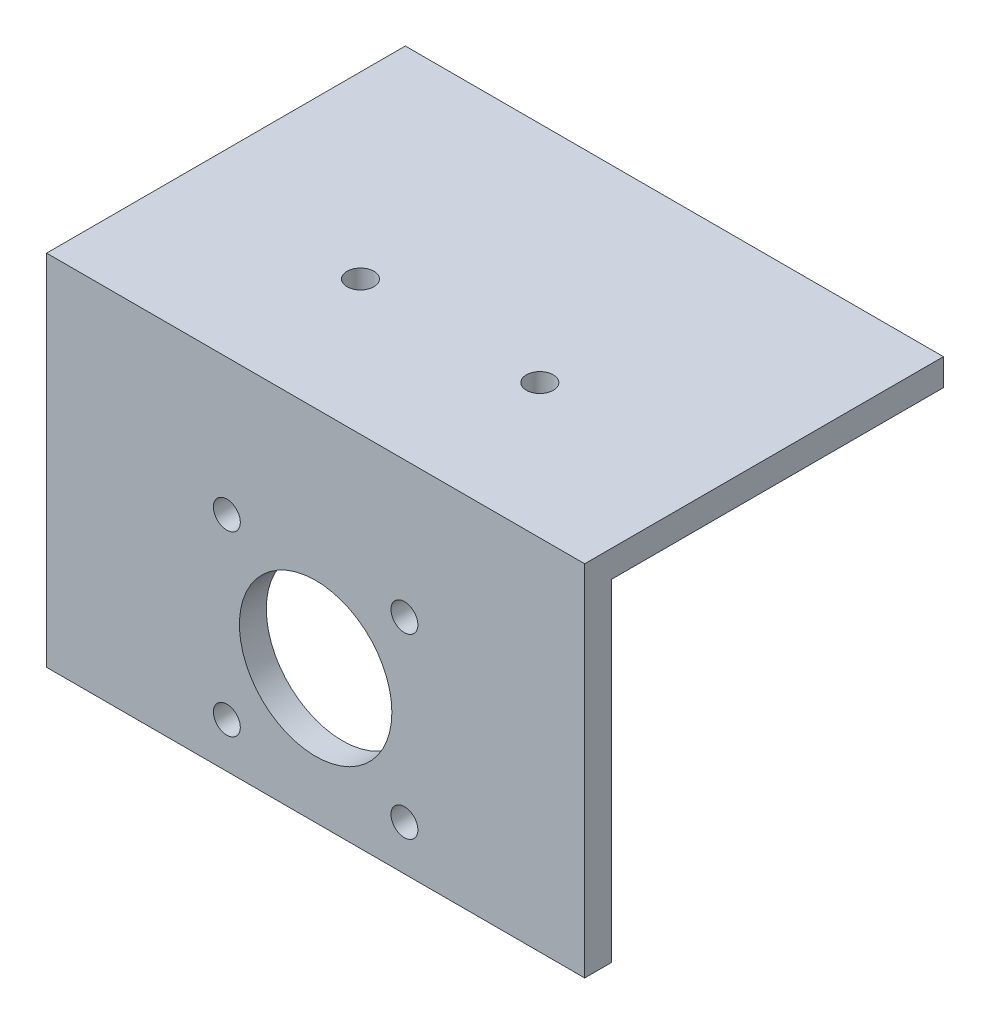
ISO-10303-21;
HEADER;
FILE_DESCRIPTION(('STEP AP214'),'2;1');
FILE_NAME('part.step','',(''),(''),'','','');
FILE_SCHEMA(('AUTOMOTIVE_DESIGN { 1 0 10303 214 1 1 1 1 }'));
ENDSEC;
DATA;
#1=APPLICATION_CONTEXT('core data for automotive mechanical design processes');
#2=APPLICATION_PROTOCOL_DEFINITION('international standard','automotive_design',2000,#1);
#3=PRODUCT_CONTEXT('',#1,'mechanical');
#4=PRODUCT('Part','Part','',(#3));
#5=PRODUCT_RELATED_PRODUCT_CATEGORY('part','',(#4));
#6=PRODUCT_DEFINITION_FORMATION('','',#4);
#7=PRODUCT_DEFINITION_CONTEXT('part definition',#1,'design');
#8=PRODUCT_DEFINITION('design','',#6,#7);
#9=PRODUCT_DEFINITION_SHAPE('','',#8);
#10=(LENGTH_UNIT() NAMED_UNIT(*) SI_UNIT(.MILLI.,.METRE.));
#11=(NAMED_UNIT(*) PLANE_ANGLE_UNIT() SI_UNIT($,.RADIAN.));
#12=(NAMED_UNIT(*) SI_UNIT($,.STERADIAN.) SOLID_ANGLE_UNIT());
#13=UNCERTAINTY_MEASURE_WITH_UNIT(LENGTH_MEASURE(1.E-05),#10,'distance_accuracy_value','');
#14=(GEOMETRIC_REPRESENTATION_CONTEXT(3) GLOBAL_UNCERTAINTY_ASSIGNED_CONTEXT((#13)) GLOBAL_UNIT_ASSIGNED_CONTEXT((#10,
#11,#12)) REPRESENTATION_CONTEXT('',''));
#15=CARTESIAN_POINT('',(0.,0.,0.));
#16=DIRECTION('',(0.,0.,1.));
#17=DIRECTION('',(1.,0.,0.));
#18=AXIS2_PLACEMENT_3D('',#15,#16,#17);
#19=CARTESIAN_POINT('',(-30.,0.,0.));
#20=DIRECTION('',(0.,0.,1.));
#21=DIRECTION('',(0.,-1.,0.));
#22=AXIS2_PLACEMENT_3D('',#19,#20,#21);
#23=PLANE('',#22);
#24=CARTESIAN_POINT('',(9.8995,-15.201,0.));
#25=DIRECTION('',(0.,0.,1.));
#26=DIRECTION('',(1.,0.,0.));
#27=AXIS2_PLACEMENT_3D('',#24,#25,#26);
#28=CIRCLE('',#27,1.5);
#29=CARTESIAN_POINT('',(11.3995,-15.201,0.));
#30=VERTEX_POINT('',#29);
#31=EDGE_CURVE('E177',#30,#30,#28,.T.);
#32=ORIENTED_EDGE('',*,*,#31,.F.);
#33=EDGE_LOOP('',(#32));
#34=FACE_BOUND('',#33,.T.);
#35=CARTESIAN_POINT('',(-9.8995,-35.,0.));
#36=DIRECTION('',(0.,0.,1.));
#37=DIRECTION('',(1.,0.,0.));
#38=AXIS2_PLACEMENT_3D('',#35,#36,#37);
#39=CIRCLE('',#38,1.5);
#40=CARTESIAN_POINT('',(-8.3995,-35.,0.));
#41=VERTEX_POINT('',#40);
#42=EDGE_CURVE('E176',#41,#41,#39,.T.);
#43=ORIENTED_EDGE('',*,*,#42,.F.);
#44=EDGE_LOOP('',(#43));
#45=FACE_BOUND('',#44,.T.);
#46=CARTESIAN_POINT('',(0.,-25.101,0.));
#47=DIRECTION('',(0.,0.,1.));
#48=DIRECTION('',(1.,0.,0.));
#49=AXIS2_PLACEMENT_3D('',#46,#47,#48);
#50=CIRCLE('',#49,8.5);
#51=CARTESIAN_POINT('',(8.5,-25.101,0.));
#52=VERTEX_POINT('',#51);
#53=EDGE_CURVE('E162',#52,#52,#50,.T.);
#54=ORIENTED_EDGE('',*,*,#53,.F.);
#55=EDGE_LOOP('',(#54));
#56=FACE_BOUND('',#55,.T.);
#57=CARTESIAN_POINT('',(9.8995,-35.,0.));
#58=DIRECTION('',(0.,0.,1.));
#59=DIRECTION('',(1.,0.,0.));
#60=AXIS2_PLACEMENT_3D('',#57,#58,#59);
#61=CIRCLE('',#60,1.5);
#62=CARTESIAN_POINT('',(11.3995,-35.,0.));
#63=VERTEX_POINT('',#62);
#64=EDGE_CURVE('E173',#63,#63,#61,.T.);
#65=ORIENTED_EDGE('',*,*,#64,.F.);
#66=EDGE_LOOP('',(#65));
#67=FACE_BOUND('',#66,.T.);
#68=CARTESIAN_POINT('',(-9.8995,-15.201,0.));
#69=DIRECTION('',(0.,0.,1.));
#70=DIRECTION('',(1.,0.,0.));
#71=AXIS2_PLACEMENT_3D('',#68,#69,#70);
#72=CIRCLE('',#71,1.5);
#73=CARTESIAN_POINT('',(-8.3995,-15.201,0.));
#74=VERTEX_POINT('',#73);
#75=EDGE_CURVE('E118',#74,#74,#72,.T.);
#76=ORIENTED_EDGE('',*,*,#75,.F.);
#77=EDGE_LOOP('',(#76));
#78=FACE_BOUND('',#77,.T.);
#79=DIRECTION('',(1.,0.,0.));
#80=VECTOR('',#79,1.);
#81=CARTESIAN_POINT('',(-30.,-40.,0.));
#82=LINE('',#81,#80);
#83=CARTESIAN_POINT('',(-30.,-40.,0.));
#84=VERTEX_POINT('',#83);
#85=CARTESIAN_POINT('',(30.,-40.,0.));
#86=VERTEX_POINT('',#85);
#87=EDGE_CURVE('E89',#84,#86,#82,.T.);
#88=ORIENTED_EDGE('',*,*,#87,.T.);
#89=DIRECTION('',(0.,-1.,0.));
#90=VECTOR('',#89,1.);
#91=CARTESIAN_POINT('',(30.,0.,0.));
#92=LINE('',#91,#90);
#93=CARTESIAN_POINT('',(30.,0.,0.));
#94=VERTEX_POINT('',#93);
#95=EDGE_CURVE('E92',#94,#86,#92,.T.);
#96=ORIENTED_EDGE('',*,*,#95,.F.);
#97=DIRECTION('',(1.,0.,0.));
#98=VECTOR('',#97,1.);
#99=CARTESIAN_POINT('',(-30.,0.,0.));
#100=LINE('',#99,#98);
#101=CARTESIAN_POINT('',(-30.,0.,0.));
#102=VERTEX_POINT('',#101);
#103=EDGE_CURVE('E11',#102,#94,#100,.T.);
#104=ORIENTED_EDGE('',*,*,#103,.F.);
#105=DIRECTION('',(0.,-1.,0.));
#106=VECTOR('',#105,1.);
#107=CARTESIAN_POINT('',(-30.,0.,0.));
#108=LINE('',#107,#106);
#109=EDGE_CURVE('E93',#102,#84,#108,.T.);
#110=ORIENTED_EDGE('',*,*,#109,.T.);
#111=EDGE_LOOP('',(#88,#96,#104,#110));
#112=FACE_BOUND('',#111,.T.);
#113=ADVANCED_FACE('F39',(#34,#45,#56,#67,#78,#112),#23,.T.);
#114=CARTESIAN_POINT('',(-30.,0.,0.));
#115=DIRECTION('',(0.,1.,0.));
#116=DIRECTION('',(0.,0.,1.));
#117=AXIS2_PLACEMENT_3D('',#114,#115,#116);
#118=PLANE('',#117);
#119=CARTESIAN_POINT('',(-10.,0.,-15.));
#120=DIRECTION('',(0.,1.,0.));
#121=DIRECTION('',(0.,0.,1.));
#122=AXIS2_PLACEMENT_3D('',#119,#120,#121);
#123=CIRCLE('',#122,1.5);
#124=CARTESIAN_POINT('',(-10.,0.,-13.5));
#125=VERTEX_POINT('',#124);
#126=EDGE_CURVE('E158',#125,#125,#123,.T.);
#127=ORIENTED_EDGE('',*,*,#126,.F.);
#128=EDGE_LOOP('',(#127));
#129=FACE_BOUND('',#128,.T.);
#130=CARTESIAN_POINT('',(10.,0.,-15.));
#131=DIRECTION('',(0.,1.,0.));
#132=DIRECTION('',(0.,0.,1.));
#133=AXIS2_PLACEMENT_3D('',#130,#131,#132);
#134=CIRCLE('',#133,1.5);
#135=CARTESIAN_POINT('',(10.,0.,-13.5));
#136=VERTEX_POINT('',#135);
#137=EDGE_CURVE('E164',#136,#136,#134,.T.);
#138=ORIENTED_EDGE('',*,*,#137,.F.);
#139=EDGE_LOOP('',(#138));
#140=FACE_BOUND('',#139,.T.);
#141=ORIENTED_EDGE('',*,*,#103,.T.);
#142=DIRECTION('',(0.,0.,1.));
#143=VECTOR('',#142,1.);
#144=CARTESIAN_POINT('',(30.,0.,0.));
#145=LINE('',#144,#143);
#146=CARTESIAN_POINT('',(30.,0.,-40.));
#147=VERTEX_POINT('',#146);
#148=EDGE_CURVE('E111',#147,#94,#145,.T.);
#149=ORIENTED_EDGE('',*,*,#148,.F.);
#150=DIRECTION('',(1.,0.,0.));
#151=VECTOR('',#150,1.);
#152=CARTESIAN_POINT('',(-30.,0.,-40.));
#153=LINE('',#152,#151);
#154=CARTESIAN_POINT('',(-30.,0.,-40.));
#155=VERTEX_POINT('',#154);
#156=EDGE_CURVE('E47',#155,#147,#153,.T.);
#157=ORIENTED_EDGE('',*,*,#156,.F.);
#158=DIRECTION('',(0.,0.,1.));
#159=VECTOR('',#158,1.);
#160=CARTESIAN_POINT('',(-30.,0.,0.));
#161=LINE('',#160,#159);
#162=EDGE_CURVE('E98',#155,#102,#161,.T.);
#163=ORIENTED_EDGE('',*,*,#162,.T.);
#164=EDGE_LOOP('',(#141,#149,#157,#163));
#165=FACE_BOUND('',#164,.T.);
#166=ADVANCED_FACE('F186',(#129,#140,#165),#118,.T.);
#167=CARTESIAN_POINT('',(-30.,0.,-40.));
#168=DIRECTION('',(0.,0.,-1.));
#169=DIRECTION('',(-1.,0.,0.));
#170=AXIS2_PLACEMENT_3D('',#167,#168,#169);
#171=PLANE('',#170);
#172=ORIENTED_EDGE('',*,*,#156,.T.);
#173=DIRECTION('',(0.,1.,0.));
#174=VECTOR('',#173,1.);
#175=CARTESIAN_POINT('',(30.,0.,-40.));
#176=LINE('',#175,#174);
#177=CARTESIAN_POINT('',(30.,-3.,-40.));
#178=VERTEX_POINT('',#177);
#179=EDGE_CURVE('E125',#178,#147,#176,.T.);
#180=ORIENTED_EDGE('',*,*,#179,.F.);
#181=DIRECTION('',(1.,0.,0.));
#182=VECTOR('',#181,1.);
#183=CARTESIAN_POINT('',(-30.,-3.,-40.));
#184=LINE('',#183,#182);
#185=CARTESIAN_POINT('',(-30.,-3.,-40.));
#186=VERTEX_POINT('',#185);
#187=EDGE_CURVE('E141',#186,#178,#184,.T.);
#188=ORIENTED_EDGE('',*,*,#187,.F.);
#189=DIRECTION('',(0.,1.,0.));
#190=VECTOR('',#189,1.);
#191=CARTESIAN_POINT('',(-30.,0.,-40.));
#192=LINE('',#191,#190);
#193=EDGE_CURVE('E137',#186,#155,#192,.T.);
#194=ORIENTED_EDGE('',*,*,#193,.T.);
#195=EDGE_LOOP('',(#172,#180,#188,#194));
#196=FACE_BOUND('',#195,.T.);
#197=ADVANCED_FACE('F218',(#196),#171,.T.);
#198=CARTESIAN_POINT('',(-30.,-3.,-3.));
#199=DIRECTION('',(0.,-1.,0.));
#200=DIRECTION('',(0.,0.,-1.));
#201=AXIS2_PLACEMENT_3D('',#198,#199,#200);
#202=PLANE('',#201);
#203=CARTESIAN_POINT('',(-10.,-3.,-15.));
#204=DIRECTION('',(0.,-1.,0.));
#205=DIRECTION('',(0.,0.,-1.));
#206=AXIS2_PLACEMENT_3D('',#203,#204,#205);
#207=CIRCLE('',#206,1.5);
#208=CARTESIAN_POINT('',(-10.,-3.,-16.5));
#209=VERTEX_POINT('',#208);
#210=EDGE_CURVE('E42',#209,#209,#207,.T.);
#211=ORIENTED_EDGE('',*,*,#210,.F.);
#212=EDGE_LOOP('',(#211));
#213=FACE_BOUND('',#212,.T.);
#214=CARTESIAN_POINT('',(10.,-3.,-15.));
#215=DIRECTION('',(0.,-1.,0.));
#216=DIRECTION('',(0.,0.,-1.));
#217=AXIS2_PLACEMENT_3D('',#214,#215,#216);
#218=CIRCLE('',#217,1.5);
#219=CARTESIAN_POINT('',(10.,-3.,-16.5));
#220=VERTEX_POINT('',#219);
#221=EDGE_CURVE('E156',#220,#220,#218,.T.);
#222=ORIENTED_EDGE('',*,*,#221,.F.);
#223=EDGE_LOOP('',(#222));
#224=FACE_BOUND('',#223,.T.);
#225=ORIENTED_EDGE('',*,*,#187,.T.);
#226=DIRECTION('',(0.,0.,-1.));
#227=VECTOR('',#226,1.);
#228=CARTESIAN_POINT('',(30.,-3.,-3.));
#229=LINE('',#228,#227);
#230=CARTESIAN_POINT('',(30.,-3.,-3.));
#231=VERTEX_POINT('',#230);
#232=EDGE_CURVE('E122',#231,#178,#229,.T.);
#233=ORIENTED_EDGE('',*,*,#232,.F.);
#234=DIRECTION('',(1.,0.,0.));
#235=VECTOR('',#234,1.);
#236=CARTESIAN_POINT('',(-30.,-3.,-3.));
#237=LINE('',#236,#235);
#238=CARTESIAN_POINT('',(-30.,-3.,-3.));
#239=VERTEX_POINT('',#238);
#240=EDGE_CURVE('E143',#239,#231,#237,.T.);
#241=ORIENTED_EDGE('',*,*,#240,.F.);
#242=DIRECTION('',(0.,0.,-1.));
#243=VECTOR('',#242,1.);
#244=CARTESIAN_POINT('',(-30.,-3.,-3.));
#245=LINE('',#244,#243);
#246=EDGE_CURVE('E134',#239,#186,#245,.T.);
#247=ORIENTED_EDGE('',*,*,#246,.T.);
#248=EDGE_LOOP('',(#225,#233,#241,#247));
#249=FACE_BOUND('',#248,.T.);
#250=ADVANCED_FACE('F222',(#213,#224,#249),#202,.T.);
#251=CARTESIAN_POINT('',(-30.,-40.,-3.));
#252=DIRECTION('',(0.,0.,-1.));
#253=DIRECTION('',(-1.,0.,0.));
#254=AXIS2_PLACEMENT_3D('',#251,#252,#253);
#255=PLANE('',#254);
#256=CARTESIAN_POINT('',(9.8995,-15.201,-3.00000000000001));
#257=DIRECTION('',(0.,0.,-1.));
#258=DIRECTION('',(-1.,0.,0.));
#259=AXIS2_PLACEMENT_3D('',#256,#257,#258);
#260=CIRCLE('',#259,1.5);
#261=CARTESIAN_POINT('',(8.3995,-15.201,-3.00000000000001));
#262=VERTEX_POINT('',#261);
#263=EDGE_CURVE('E112',#262,#262,#260,.T.);
#264=ORIENTED_EDGE('',*,*,#263,.F.);
#265=EDGE_LOOP('',(#264));
#266=FACE_BOUND('',#265,.T.);
#267=CARTESIAN_POINT('',(-9.8995,-35.,-3.00000000000001));
#268=DIRECTION('',(0.,0.,-1.));
#269=DIRECTION('',(-1.,0.,0.));
#270=AXIS2_PLACEMENT_3D('',#267,#268,#269);
#271=CIRCLE('',#270,1.5);
#272=CARTESIAN_POINT('',(-11.3995,-35.,-3.00000000000001));
#273=VERTEX_POINT('',#272);
#274=EDGE_CURVE('E115',#273,#273,#271,.T.);
#275=ORIENTED_EDGE('',*,*,#274,.F.);
#276=EDGE_LOOP('',(#275));
#277=FACE_BOUND('',#276,.T.);
#278=CARTESIAN_POINT('',(0.,-25.101,-3.00000000000001));
#279=DIRECTION('',(0.,0.,-1.));
#280=DIRECTION('',(-1.,0.,0.));
#281=AXIS2_PLACEMENT_3D('',#278,#279,#280);
#282=CIRCLE('',#281,8.5);
#283=CARTESIAN_POINT('',(-8.5,-25.101,-3.00000000000001));
#284=VERTEX_POINT('',#283);
#285=EDGE_CURVE('E152',#284,#284,#282,.T.);
#286=ORIENTED_EDGE('',*,*,#285,.F.);
#287=EDGE_LOOP('',(#286));
#288=FACE_BOUND('',#287,.T.);
#289=CARTESIAN_POINT('',(9.8995,-35.,-3.00000000000001));
#290=DIRECTION('',(0.,0.,-1.));
#291=DIRECTION('',(-1.,0.,0.));
#292=AXIS2_PLACEMENT_3D('',#289,#290,#291);
#293=CIRCLE('',#292,1.5);
#294=CARTESIAN_POINT('',(8.3995,-35.,-3.00000000000001));
#295=VERTEX_POINT('',#294);
#296=EDGE_CURVE('E149',#295,#295,#293,.T.);
#297=ORIENTED_EDGE('',*,*,#296,.F.);
#298=EDGE_LOOP('',(#297));
#299=FACE_BOUND('',#298,.T.);
#300=CARTESIAN_POINT('',(-9.8995,-15.201,-3.00000000000001));
#301=DIRECTION('',(0.,0.,-1.));
#302=DIRECTION('',(-1.,0.,0.));
#303=AXIS2_PLACEMENT_3D('',#300,#301,#302);
#304=CIRCLE('',#303,1.5);
#305=CARTESIAN_POINT('',(-11.3995,-15.201,-3.00000000000001));
#306=VERTEX_POINT('',#305);
#307=EDGE_CURVE('E146',#306,#306,#304,.T.);
#308=ORIENTED_EDGE('',*,*,#307,.F.);
#309=EDGE_LOOP('',(#308));
#310=FACE_BOUND('',#309,.T.);
#311=ORIENTED_EDGE('',*,*,#240,.T.);
#312=DIRECTION('',(0.,1.,0.));
#313=VECTOR('',#312,1.);
#314=CARTESIAN_POINT('',(30.,-40.,-3.));
#315=LINE('',#314,#313);
#316=CARTESIAN_POINT('',(30.,-40.,-3.));
#317=VERTEX_POINT('',#316);
#318=EDGE_CURVE('E106',#317,#231,#315,.T.);
#319=ORIENTED_EDGE('',*,*,#318,.F.);
#320=DIRECTION('',(1.,0.,0.));
#321=VECTOR('',#320,1.);
#322=CARTESIAN_POINT('',(-30.,-40.,-3.));
#323=LINE('',#322,#321);
#324=CARTESIAN_POINT('',(-30.,-40.,-3.));
#325=VERTEX_POINT('',#324);
#326=EDGE_CURVE('E97',#325,#317,#323,.T.);
#327=ORIENTED_EDGE('',*,*,#326,.F.);
#328=DIRECTION('',(0.,1.,0.));
#329=VECTOR('',#328,1.);
#330=CARTESIAN_POINT('',(-30.,-40.,-3.));
#331=LINE('',#330,#329);
#332=EDGE_CURVE('E131',#325,#239,#331,.T.);
#333=ORIENTED_EDGE('',*,*,#332,.T.);
#334=EDGE_LOOP('',(#311,#319,#327,#333));
#335=FACE_BOUND('',#334,.T.);
#336=ADVANCED_FACE('F226',(#266,#277,#288,#299,#310,#335),#255,.T.);
#337=CARTESIAN_POINT('',(-30.,-40.,0.));
#338=DIRECTION('',(0.,-1.,0.));
#339=DIRECTION('',(0.,0.,-1.));
#340=AXIS2_PLACEMENT_3D('',#337,#338,#339);
#341=PLANE('',#340);
#342=ORIENTED_EDGE('',*,*,#326,.T.);
#343=DIRECTION('',(0.,0.,-1.));
#344=VECTOR('',#343,1.);
#345=CARTESIAN_POINT('',(30.,-40.,0.));
#346=LINE('',#345,#344);
#347=EDGE_CURVE('E101',#86,#317,#346,.T.);
#348=ORIENTED_EDGE('',*,*,#347,.F.);
#349=ORIENTED_EDGE('',*,*,#87,.F.);
#350=DIRECTION('',(0.,0.,-1.));
#351=VECTOR('',#350,1.);
#352=CARTESIAN_POINT('',(-30.,-40.,0.));
#353=LINE('',#352,#351);
#354=EDGE_CURVE('E129',#84,#325,#353,.T.);
#355=ORIENTED_EDGE('',*,*,#354,.T.);
#356=EDGE_LOOP('',(#342,#348,#349,#355));
#357=FACE_BOUND('',#356,.T.);
#358=ADVANCED_FACE('F102',(#357),#341,.T.);
#359=CARTESIAN_POINT('',(-30.,0.,0.));
#360=DIRECTION('',(1.,0.,0.));
#361=DIRECTION('',(0.,0.,-1.));
#362=AXIS2_PLACEMENT_3D('',#359,#360,#361);
#363=PLANE('',#362);
#364=ORIENTED_EDGE('',*,*,#109,.F.);
#365=ORIENTED_EDGE('',*,*,#162,.F.);
#366=ORIENTED_EDGE('',*,*,#193,.F.);
#367=ORIENTED_EDGE('',*,*,#246,.F.);
#368=ORIENTED_EDGE('',*,*,#332,.F.);
#369=ORIENTED_EDGE('',*,*,#354,.F.);
#370=EDGE_LOOP('',(#364,#365,#366,#367,#368,#369));
#371=FACE_BOUND('',#370,.T.);
#372=ADVANCED_FACE('F208',(#371),#363,.F.);
#373=CARTESIAN_POINT('',(30.,0.,0.));
#374=DIRECTION('',(1.,0.,0.));
#375=DIRECTION('',(0.,0.,-1.));
#376=AXIS2_PLACEMENT_3D('',#373,#374,#375);
#377=PLANE('',#376);
#378=ORIENTED_EDGE('',*,*,#95,.T.);
#379=ORIENTED_EDGE('',*,*,#347,.T.);
#380=ORIENTED_EDGE('',*,*,#318,.T.);
#381=ORIENTED_EDGE('',*,*,#232,.T.);
#382=ORIENTED_EDGE('',*,*,#179,.T.);
#383=ORIENTED_EDGE('',*,*,#148,.T.);
#384=EDGE_LOOP('',(#378,#379,#380,#381,#382,#383));
#385=FACE_BOUND('',#384,.T.);
#386=ADVANCED_FACE('F109',(#385),#377,.T.);
#387=CARTESIAN_POINT('',(-9.8995,-15.201,-30.));
#388=DIRECTION('',(0.,0.,1.));
#389=DIRECTION('',(1.,0.,0.));
#390=AXIS2_PLACEMENT_3D('',#387,#388,#389);
#391=CYLINDRICAL_SURFACE('',#390,1.5);
#392=ORIENTED_EDGE('',*,*,#307,.T.);
#393=EDGE_LOOP('',(#392));
#394=FACE_BOUND('',#393,.T.);
#395=ORIENTED_EDGE('',*,*,#75,.T.);
#396=EDGE_LOOP('',(#395));
#397=FACE_BOUND('',#396,.T.);
#398=ADVANCED_FACE('F195',(#394,#397),#391,.F.);
#399=CARTESIAN_POINT('',(9.8995,-35.,-30.));
#400=DIRECTION('',(0.,0.,1.));
#401=DIRECTION('',(1.,0.,0.));
#402=AXIS2_PLACEMENT_3D('',#399,#400,#401);
#403=CYLINDRICAL_SURFACE('',#402,1.5);
#404=ORIENTED_EDGE('',*,*,#296,.T.);
#405=EDGE_LOOP('',(#404));
#406=FACE_BOUND('',#405,.T.);
#407=ORIENTED_EDGE('',*,*,#64,.T.);
#408=EDGE_LOOP('',(#407));
#409=FACE_BOUND('',#408,.T.);
#410=ADVANCED_FACE('F197',(#406,#409),#403,.F.);
#411=CARTESIAN_POINT('',(0.,-25.101,-30.));
#412=DIRECTION('',(0.,0.,1.));
#413=DIRECTION('',(1.,0.,0.));
#414=AXIS2_PLACEMENT_3D('',#411,#412,#413);
#415=CYLINDRICAL_SURFACE('',#414,8.5);
#416=ORIENTED_EDGE('',*,*,#285,.T.);
#417=EDGE_LOOP('',(#416));
#418=FACE_BOUND('',#417,.T.);
#419=ORIENTED_EDGE('',*,*,#53,.T.);
#420=EDGE_LOOP('',(#419));
#421=FACE_BOUND('',#420,.T.);
#422=ADVANCED_FACE('F204',(#418,#421),#415,.F.);
#423=CARTESIAN_POINT('',(-9.8995,-35.,-30.));
#424=DIRECTION('',(0.,0.,1.));
#425=DIRECTION('',(1.,0.,0.));
#426=AXIS2_PLACEMENT_3D('',#423,#424,#425);
#427=CYLINDRICAL_SURFACE('',#426,1.5);
#428=ORIENTED_EDGE('',*,*,#274,.T.);
#429=EDGE_LOOP('',(#428));
#430=FACE_BOUND('',#429,.T.);
#431=ORIENTED_EDGE('',*,*,#42,.T.);
#432=EDGE_LOOP('',(#431));
#433=FACE_BOUND('',#432,.T.);
#434=ADVANCED_FACE('F182',(#430,#433),#427,.F.);
#435=CARTESIAN_POINT('',(9.8995,-15.201,-30.));
#436=DIRECTION('',(0.,0.,1.));
#437=DIRECTION('',(1.,0.,0.));
#438=AXIS2_PLACEMENT_3D('',#435,#436,#437);
#439=CYLINDRICAL_SURFACE('',#438,1.5);
#440=ORIENTED_EDGE('',*,*,#263,.T.);
#441=EDGE_LOOP('',(#440));
#442=FACE_BOUND('',#441,.T.);
#443=ORIENTED_EDGE('',*,*,#31,.T.);
#444=EDGE_LOOP('',(#443));
#445=FACE_BOUND('',#444,.T.);
#446=ADVANCED_FACE('F276',(#442,#445),#439,.F.);
#447=CARTESIAN_POINT('',(10.,-30.,-15.));
#448=DIRECTION('',(0.,1.,0.));
#449=DIRECTION('',(0.,0.,1.));
#450=AXIS2_PLACEMENT_3D('',#447,#448,#449);
#451=CYLINDRICAL_SURFACE('',#450,1.5);
#452=ORIENTED_EDGE('',*,*,#221,.T.);
#453=EDGE_LOOP('',(#452));
#454=FACE_BOUND('',#453,.T.);
#455=ORIENTED_EDGE('',*,*,#137,.T.);
#456=EDGE_LOOP('',(#455));
#457=FACE_BOUND('',#456,.T.);
#458=ADVANCED_FACE('F280',(#454,#457),#451,.F.);
#459=CARTESIAN_POINT('',(-10.,-30.,-15.));
#460=DIRECTION('',(0.,1.,0.));
#461=DIRECTION('',(0.,0.,1.));
#462=AXIS2_PLACEMENT_3D('',#459,#460,#461);
#463=CYLINDRICAL_SURFACE('',#462,1.5);
#464=ORIENTED_EDGE('',*,*,#210,.T.);
#465=EDGE_LOOP('',(#464));
#466=FACE_BOUND('',#465,.T.);
#467=ORIENTED_EDGE('',*,*,#126,.T.);
#468=EDGE_LOOP('',(#467));
#469=FACE_BOUND('',#468,.T.);
#470=ADVANCED_FACE('F319',(#466,#469),#463,.F.);
#471=CLOSED_SHELL('',(#113,#166,#197,#250,#336,#358,#372,#386,#398,#410,#422,#434,#446,#458,#470));
#472=MANIFOLD_SOLID_BREP('B2',#471);
#473=ADVANCED_BREP_SHAPE_REPRESENTATION('',(#18,#472),#14);
#474=SHAPE_DEFINITION_REPRESENTATION(#9,#473);
ENDSEC;
END-ISO-10303-21;
